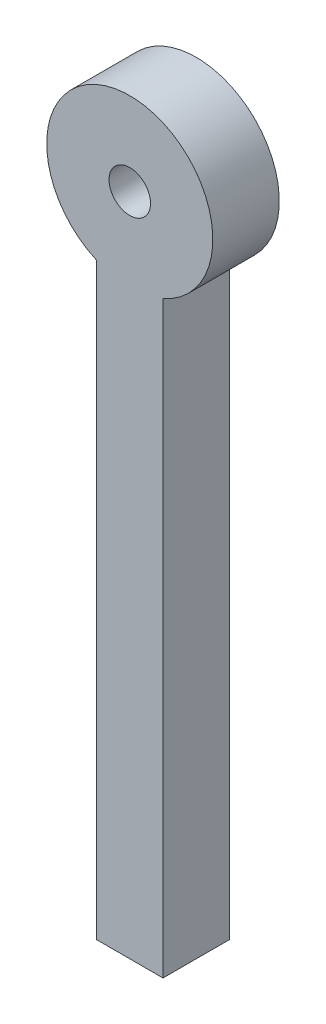
ISO-10303-21;
HEADER;
FILE_DESCRIPTION(('STEP AP214'),'2;1');
FILE_NAME('part.step','',(''),(''),'','','');
FILE_SCHEMA(('AUTOMOTIVE_DESIGN { 1 0 10303 214 1 1 1 1 }'));
ENDSEC;
DATA;
#1=APPLICATION_CONTEXT('core data for automotive mechanical design processes');
#2=APPLICATION_PROTOCOL_DEFINITION('international standard','automotive_design',2000,#1);
#3=PRODUCT_CONTEXT('',#1,'mechanical');
#4=PRODUCT('Part','Part','',(#3));
#5=PRODUCT_RELATED_PRODUCT_CATEGORY('part','',(#4));
#6=PRODUCT_DEFINITION_FORMATION('','',#4);
#7=PRODUCT_DEFINITION_CONTEXT('part definition',#1,'design');
#8=PRODUCT_DEFINITION('design','',#6,#7);
#9=PRODUCT_DEFINITION_SHAPE('','',#8);
#10=(LENGTH_UNIT() NAMED_UNIT(*) SI_UNIT(.MILLI.,.METRE.));
#11=(NAMED_UNIT(*) PLANE_ANGLE_UNIT() SI_UNIT($,.RADIAN.));
#12=(NAMED_UNIT(*) SI_UNIT($,.STERADIAN.) SOLID_ANGLE_UNIT());
#13=UNCERTAINTY_MEASURE_WITH_UNIT(LENGTH_MEASURE(1.E-05),#10,'distance_accuracy_value','');
#14=(GEOMETRIC_REPRESENTATION_CONTEXT(3) GLOBAL_UNCERTAINTY_ASSIGNED_CONTEXT((#13)) GLOBAL_UNIT_ASSIGNED_CONTEXT((#10,
#11,#12)) REPRESENTATION_CONTEXT('',''));
#15=CARTESIAN_POINT('',(0.,0.,0.));
#16=DIRECTION('',(0.,0.,1.));
#17=DIRECTION('',(1.,0.,0.));
#18=AXIS2_PLACEMENT_3D('',#15,#16,#17);
#19=CARTESIAN_POINT('',(0.,-80.,8.));
#20=DIRECTION('',(0.,-1.,0.));
#21=DIRECTION('',(0.,0.,-1.));
#22=AXIS2_PLACEMENT_3D('',#19,#20,#21);
#23=PLANE('',#22);
#24=DIRECTION('',(-1.,0.,0.));
#25=VECTOR('',#24,1.);
#26=CARTESIAN_POINT('',(0.,-80.,0.));
#27=LINE('',#26,#25);
#28=CARTESIAN_POINT('',(4.00000000000001,-80.,0.));
#29=VERTEX_POINT('',#28);
#30=CARTESIAN_POINT('',(-3.99999999999999,-80.,0.));
#31=VERTEX_POINT('',#30);
#32=EDGE_CURVE('E100',#29,#31,#27,.T.);
#33=ORIENTED_EDGE('',*,*,#32,.F.);
#34=DIRECTION('',(0.,0.,-1.));
#35=VECTOR('',#34,1.);
#36=CARTESIAN_POINT('',(4.00000000000001,-80.,8.));
#37=LINE('',#36,#35);
#38=CARTESIAN_POINT('',(4.00000000000001,-80.,8.));
#39=VERTEX_POINT('',#38);
#40=EDGE_CURVE('E11',#39,#29,#37,.T.);
#41=ORIENTED_EDGE('',*,*,#40,.F.);
#42=DIRECTION('',(-1.,0.,0.));
#43=VECTOR('',#42,1.);
#44=CARTESIAN_POINT('',(0.,-80.,8.));
#45=LINE('',#44,#43);
#46=CARTESIAN_POINT('',(-3.99999999999999,-80.,8.));
#47=VERTEX_POINT('',#46);
#48=EDGE_CURVE('E85',#39,#47,#45,.T.);
#49=ORIENTED_EDGE('',*,*,#48,.T.);
#50=DIRECTION('',(0.,0.,-1.));
#51=VECTOR('',#50,1.);
#52=CARTESIAN_POINT('',(-3.99999999999999,-80.,8.));
#53=LINE('',#52,#51);
#54=EDGE_CURVE('E53',#47,#31,#53,.T.);
#55=ORIENTED_EDGE('',*,*,#54,.T.);
#56=EDGE_LOOP('',(#33,#41,#49,#55));
#57=FACE_BOUND('',#56,.T.);
#58=ADVANCED_FACE('F37',(#57),#23,.T.);
#59=CARTESIAN_POINT('',(4.00000000000001,0.,8.));
#60=DIRECTION('',(-1.,0.,0.));
#61=DIRECTION('',(0.,0.,1.));
#62=AXIS2_PLACEMENT_3D('',#59,#60,#61);
#63=PLANE('',#62);
#64=DIRECTION('',(0.,1.,0.));
#65=VECTOR('',#64,1.);
#66=CARTESIAN_POINT('',(4.00000000000001,0.,0.));
#67=LINE('',#66,#65);
#68=CARTESIAN_POINT('',(4.00000000000001,-9.16515138991168,0.));
#69=VERTEX_POINT('',#68);
#70=EDGE_CURVE('E91',#29,#69,#67,.T.);
#71=ORIENTED_EDGE('',*,*,#70,.T.);
#72=DIRECTION('',(0.,0.,-1.));
#73=VECTOR('',#72,1.);
#74=CARTESIAN_POINT('',(4.00000000000001,-9.16515138991168,8.));
#75=LINE('',#74,#73);
#76=CARTESIAN_POINT('',(4.00000000000001,-9.16515138991168,8.));
#77=VERTEX_POINT('',#76);
#78=EDGE_CURVE('E45',#77,#69,#75,.T.);
#79=ORIENTED_EDGE('',*,*,#78,.F.);
#80=DIRECTION('',(0.,1.,0.));
#81=VECTOR('',#80,1.);
#82=CARTESIAN_POINT('',(4.00000000000001,0.,8.));
#83=LINE('',#82,#81);
#84=EDGE_CURVE('E79',#39,#77,#83,.T.);
#85=ORIENTED_EDGE('',*,*,#84,.F.);
#86=ORIENTED_EDGE('',*,*,#40,.T.);
#87=EDGE_LOOP('',(#71,#79,#85,#86));
#88=FACE_BOUND('',#87,.T.);
#89=ADVANCED_FACE('F89',(#88),#63,.F.);
#90=CARTESIAN_POINT('',(0.,0.,8.));
#91=DIRECTION('',(0.,0.,-1.));
#92=DIRECTION('',(-1.,0.,0.));
#93=AXIS2_PLACEMENT_3D('',#90,#91,#92);
#94=CYLINDRICAL_SURFACE('',#93,10.);
#95=CARTESIAN_POINT('',(0.,0.,0.));
#96=DIRECTION('',(0.,0.,1.));
#97=DIRECTION('',(1.,0.,0.));
#98=AXIS2_PLACEMENT_3D('',#95,#96,#97);
#99=CIRCLE('',#98,10.);
#100=CARTESIAN_POINT('',(-3.99999999999999,-9.16515138991169,0.));
#101=VERTEX_POINT('',#100);
#102=EDGE_CURVE('E104',#69,#101,#99,.T.);
#103=ORIENTED_EDGE('',*,*,#102,.T.);
#104=DIRECTION('',(0.,0.,-1.));
#105=VECTOR('',#104,1.);
#106=CARTESIAN_POINT('',(-3.99999999999999,-9.16515138991169,8.));
#107=LINE('',#106,#105);
#108=CARTESIAN_POINT('',(-3.99999999999999,-9.16515138991169,8.));
#109=VERTEX_POINT('',#108);
#110=EDGE_CURVE('E67',#109,#101,#107,.T.);
#111=ORIENTED_EDGE('',*,*,#110,.F.);
#112=CARTESIAN_POINT('',(0.,0.,8.));
#113=DIRECTION('',(0.,0.,1.));
#114=DIRECTION('',(1.,0.,0.));
#115=AXIS2_PLACEMENT_3D('',#112,#113,#114);
#116=CIRCLE('',#115,10.);
#117=EDGE_CURVE('E84',#77,#109,#116,.T.);
#118=ORIENTED_EDGE('',*,*,#117,.F.);
#119=ORIENTED_EDGE('',*,*,#78,.T.);
#120=EDGE_LOOP('',(#103,#111,#118,#119));
#121=FACE_BOUND('',#120,.T.);
#122=ADVANCED_FACE('F94',(#121),#94,.T.);
#123=CARTESIAN_POINT('',(-3.99999999999999,0.,8.));
#124=DIRECTION('',(-1.,0.,0.));
#125=DIRECTION('',(0.,0.,1.));
#126=AXIS2_PLACEMENT_3D('',#123,#124,#125);
#127=PLANE('',#126);
#128=DIRECTION('',(0.,1.,0.));
#129=VECTOR('',#128,1.);
#130=CARTESIAN_POINT('',(-3.99999999999999,0.,0.));
#131=LINE('',#130,#129);
#132=EDGE_CURVE('E106',#31,#101,#131,.T.);
#133=ORIENTED_EDGE('',*,*,#132,.F.);
#134=ORIENTED_EDGE('',*,*,#54,.F.);
#135=DIRECTION('',(0.,1.,0.));
#136=VECTOR('',#135,1.);
#137=CARTESIAN_POINT('',(-3.99999999999999,0.,8.));
#138=LINE('',#137,#136);
#139=EDGE_CURVE('E95',#47,#109,#138,.T.);
#140=ORIENTED_EDGE('',*,*,#139,.T.);
#141=ORIENTED_EDGE('',*,*,#110,.T.);
#142=EDGE_LOOP('',(#133,#134,#140,#141));
#143=FACE_BOUND('',#142,.T.);
#144=ADVANCED_FACE('F122',(#143),#127,.T.);
#145=CARTESIAN_POINT('',(0.,0.,8.));
#146=DIRECTION('',(0.,0.,1.));
#147=DIRECTION('',(1.,0.,0.));
#148=AXIS2_PLACEMENT_3D('',#145,#146,#147);
#149=PLANE('',#148);
#150=CARTESIAN_POINT('',(0.,0.,8.));
#151=DIRECTION('',(0.,0.,1.));
#152=DIRECTION('',(1.,0.,0.));
#153=AXIS2_PLACEMENT_3D('',#150,#151,#152);
#154=CIRCLE('',#153,2.49999999999999);
#155=CARTESIAN_POINT('',(2.49999999999999,0.,8.));
#156=VERTEX_POINT('',#155);
#157=EDGE_CURVE('E114',#156,#156,#154,.T.);
#158=ORIENTED_EDGE('',*,*,#157,.F.);
#159=EDGE_LOOP('',(#158));
#160=FACE_BOUND('',#159,.T.);
#161=ORIENTED_EDGE('',*,*,#48,.F.);
#162=ORIENTED_EDGE('',*,*,#84,.T.);
#163=ORIENTED_EDGE('',*,*,#117,.T.);
#164=ORIENTED_EDGE('',*,*,#139,.F.);
#165=EDGE_LOOP('',(#161,#162,#163,#164));
#166=FACE_BOUND('',#165,.T.);
#167=ADVANCED_FACE('F81',(#160,#166),#149,.T.);
#168=CARTESIAN_POINT('',(0.,0.,0.));
#169=DIRECTION('',(0.,0.,1.));
#170=DIRECTION('',(1.,0.,0.));
#171=AXIS2_PLACEMENT_3D('',#168,#169,#170);
#172=PLANE('',#171);
#173=CARTESIAN_POINT('',(0.,0.,0.));
#174=DIRECTION('',(0.,0.,1.));
#175=DIRECTION('',(1.,0.,0.));
#176=AXIS2_PLACEMENT_3D('',#173,#174,#175);
#177=CIRCLE('',#176,2.5);
#178=CARTESIAN_POINT('',(2.5,0.,0.));
#179=VERTEX_POINT('',#178);
#180=EDGE_CURVE('E102',#179,#179,#177,.T.);
#181=ORIENTED_EDGE('',*,*,#180,.T.);
#182=EDGE_LOOP('',(#181));
#183=FACE_BOUND('',#182,.T.);
#184=ORIENTED_EDGE('',*,*,#32,.T.);
#185=ORIENTED_EDGE('',*,*,#132,.T.);
#186=ORIENTED_EDGE('',*,*,#102,.F.);
#187=ORIENTED_EDGE('',*,*,#70,.F.);
#188=EDGE_LOOP('',(#184,#185,#186,#187));
#189=FACE_BOUND('',#188,.T.);
#190=ADVANCED_FACE('F121',(#183,#189),#172,.F.);
#191=CARTESIAN_POINT('',(0.,0.,8.));
#192=DIRECTION('',(0.,0.,1.));
#193=DIRECTION('',(1.,0.,0.));
#194=AXIS2_PLACEMENT_3D('',#191,#192,#193);
#195=CYLINDRICAL_SURFACE('',#194,2.49999999999999);
#196=ORIENTED_EDGE('',*,*,#180,.F.);
#197=EDGE_LOOP('',(#196));
#198=FACE_BOUND('',#197,.T.);
#199=ORIENTED_EDGE('',*,*,#157,.T.);
#200=EDGE_LOOP('',(#199));
#201=FACE_BOUND('',#200,.T.);
#202=ADVANCED_FACE('F118',(#198,#201),#195,.F.);
#203=CLOSED_SHELL('',(#58,#89,#122,#144,#167,#190,#202));
#204=MANIFOLD_SOLID_BREP('B2',#203);
#205=ADVANCED_BREP_SHAPE_REPRESENTATION('',(#18,#204),#14);
#206=SHAPE_DEFINITION_REPRESENTATION(#9,#205);
ENDSEC;
END-ISO-10303-21;
